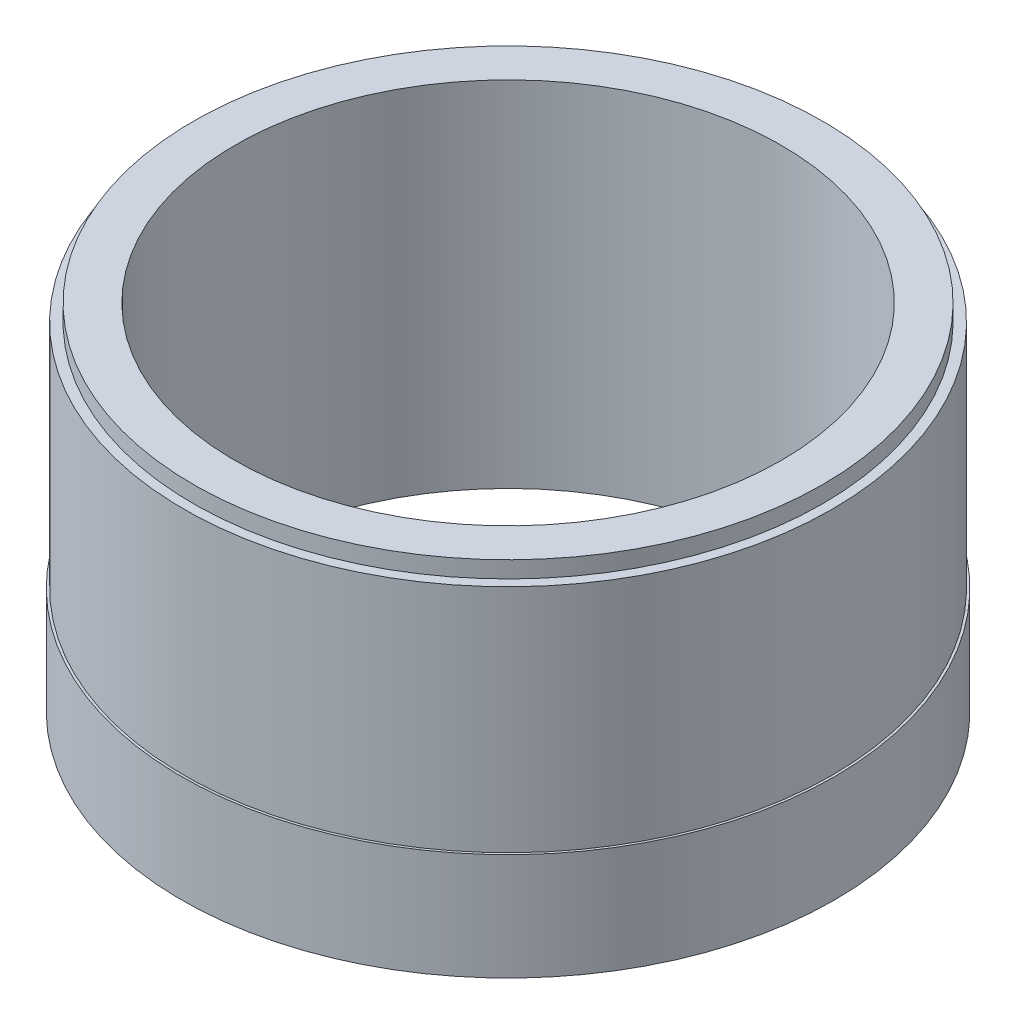
ISO-10303-21;
HEADER;
FILE_DESCRIPTION(('STEP AP214'),'2;1');
FILE_NAME('part.step','',(''),(''),'','','');
FILE_SCHEMA(('AUTOMOTIVE_DESIGN { 1 0 10303 214 1 1 1 1 }'));
ENDSEC;
DATA;
#1=APPLICATION_CONTEXT('core data for automotive mechanical design processes');
#2=APPLICATION_PROTOCOL_DEFINITION('international standard','automotive_design',2000,#1);
#3=PRODUCT_CONTEXT('',#1,'mechanical');
#4=PRODUCT('Part','Part','',(#3));
#5=PRODUCT_RELATED_PRODUCT_CATEGORY('part','',(#4));
#6=PRODUCT_DEFINITION_FORMATION('','',#4);
#7=PRODUCT_DEFINITION_CONTEXT('part definition',#1,'design');
#8=PRODUCT_DEFINITION('design','',#6,#7);
#9=PRODUCT_DEFINITION_SHAPE('','',#8);
#10=(LENGTH_UNIT() NAMED_UNIT(*) SI_UNIT(.MILLI.,.METRE.));
#11=(NAMED_UNIT(*) PLANE_ANGLE_UNIT() SI_UNIT($,.RADIAN.));
#12=(NAMED_UNIT(*) SI_UNIT($,.STERADIAN.) SOLID_ANGLE_UNIT());
#13=UNCERTAINTY_MEASURE_WITH_UNIT(LENGTH_MEASURE(1.E-05),#10,'distance_accuracy_value','');
#14=(GEOMETRIC_REPRESENTATION_CONTEXT(3) GLOBAL_UNCERTAINTY_ASSIGNED_CONTEXT((#13)) GLOBAL_UNIT_ASSIGNED_CONTEXT((#10,
#11,#12)) REPRESENTATION_CONTEXT('',''));
#15=CARTESIAN_POINT('',(0.,0.,0.));
#16=DIRECTION('',(0.,0.,1.));
#17=DIRECTION('',(1.,0.,0.));
#18=AXIS2_PLACEMENT_3D('',#15,#16,#17);
#19=CARTESIAN_POINT('',(137.5,50.,0.));
#20=DIRECTION('',(0.,1.,0.));
#21=DIRECTION('',(-1.,0.,0.));
#22=AXIS2_PLACEMENT_3D('',#19,#20,#21);
#23=PLANE('',#22);
#24=CARTESIAN_POINT('',(0.,50.,0.));
#25=DIRECTION('',(0.,-1.,0.));
#26=DIRECTION('',(1.,0.,0.));
#27=AXIS2_PLACEMENT_3D('',#24,#25,#26);
#28=CIRCLE('',#27,136.5);
#29=CARTESIAN_POINT('',(136.5,50.,0.));
#30=VERTEX_POINT('',#29);
#31=EDGE_CURVE('E65',#30,#30,#28,.T.);
#32=ORIENTED_EDGE('',*,*,#31,.T.);
#33=EDGE_LOOP('',(#32));
#34=FACE_BOUND('',#33,.T.);
#35=CARTESIAN_POINT('',(0.,50.,0.));
#36=DIRECTION('',(0.,-1.,0.));
#37=DIRECTION('',(1.,0.,0.));
#38=AXIS2_PLACEMENT_3D('',#35,#36,#37);
#39=CIRCLE('',#38,137.5);
#40=CARTESIAN_POINT('',(137.5,50.,0.));
#41=VERTEX_POINT('',#40);
#42=EDGE_CURVE('E10',#41,#41,#39,.T.);
#43=ORIENTED_EDGE('',*,*,#42,.F.);
#44=EDGE_LOOP('',(#43));
#45=FACE_BOUND('',#44,.T.);
#46=ADVANCED_FACE('F37',(#34,#45),#23,.T.);
#47=CARTESIAN_POINT('',(0.,154.,0.));
#48=DIRECTION('',(0.,-1.,0.));
#49=DIRECTION('',(1.,0.,0.));
#50=AXIS2_PLACEMENT_3D('',#47,#48,#49);
#51=CYLINDRICAL_SURFACE('',#50,137.5);
#52=ORIENTED_EDGE('',*,*,#42,.T.);
#53=EDGE_LOOP('',(#52));
#54=FACE_BOUND('',#53,.T.);
#55=CARTESIAN_POINT('',(0.,5.,0.));
#56=DIRECTION('',(0.,-1.,0.));
#57=DIRECTION('',(1.,0.,0.));
#58=AXIS2_PLACEMENT_3D('',#55,#56,#57);
#59=CIRCLE('',#58,137.5);
#60=CARTESIAN_POINT('',(137.5,5.00000000000001,0.));
#61=VERTEX_POINT('',#60);
#62=EDGE_CURVE('E43',#61,#61,#59,.T.);
#63=ORIENTED_EDGE('',*,*,#62,.F.);
#64=EDGE_LOOP('',(#63));
#65=FACE_BOUND('',#64,.T.);
#66=ADVANCED_FACE('F83',(#54,#65),#51,.T.);
#67=CARTESIAN_POINT('',(115.,5.,0.));
#68=DIRECTION('',(0.,-1.,0.));
#69=DIRECTION('',(1.,0.,0.));
#70=AXIS2_PLACEMENT_3D('',#67,#68,#69);
#71=PLANE('',#70);
#72=ORIENTED_EDGE('',*,*,#62,.T.);
#73=EDGE_LOOP('',(#72));
#74=FACE_BOUND('',#73,.T.);
#75=CARTESIAN_POINT('',(0.,5.,0.));
#76=DIRECTION('',(0.,-1.,0.));
#77=DIRECTION('',(1.,0.,0.));
#78=AXIS2_PLACEMENT_3D('',#75,#76,#77);
#79=CIRCLE('',#78,115.);
#80=CARTESIAN_POINT('',(115.,5.00000000000001,0.));
#81=VERTEX_POINT('',#80);
#82=EDGE_CURVE('E47',#81,#81,#79,.T.);
#83=ORIENTED_EDGE('',*,*,#82,.F.);
#84=EDGE_LOOP('',(#83));
#85=FACE_BOUND('',#84,.T.);
#86=ADVANCED_FACE('F87',(#74,#85),#71,.T.);
#87=CARTESIAN_POINT('',(0.,154.,0.));
#88=DIRECTION('',(0.,-1.,0.));
#89=DIRECTION('',(1.,0.,0.));
#90=AXIS2_PLACEMENT_3D('',#87,#88,#89);
#91=CYLINDRICAL_SURFACE('',#90,115.);
#92=ORIENTED_EDGE('',*,*,#82,.T.);
#93=EDGE_LOOP('',(#92));
#94=FACE_BOUND('',#93,.T.);
#95=CARTESIAN_POINT('',(0.,154.,0.));
#96=DIRECTION('',(0.,-1.,0.));
#97=DIRECTION('',(1.,0.,0.));
#98=AXIS2_PLACEMENT_3D('',#95,#96,#97);
#99=CIRCLE('',#98,115.);
#100=CARTESIAN_POINT('',(115.,154.,0.));
#101=VERTEX_POINT('',#100);
#102=EDGE_CURVE('E51',#101,#101,#99,.T.);
#103=ORIENTED_EDGE('',*,*,#102,.F.);
#104=EDGE_LOOP('',(#103));
#105=FACE_BOUND('',#104,.T.);
#106=ADVANCED_FACE('F91',(#94,#105),#91,.F.);
#107=CARTESIAN_POINT('',(132.5,154.,0.));
#108=DIRECTION('',(0.,1.,0.));
#109=DIRECTION('',(-1.,0.,0.));
#110=AXIS2_PLACEMENT_3D('',#107,#108,#109);
#111=PLANE('',#110);
#112=ORIENTED_EDGE('',*,*,#102,.T.);
#113=EDGE_LOOP('',(#112));
#114=FACE_BOUND('',#113,.T.);
#115=CARTESIAN_POINT('',(0.,154.,0.));
#116=DIRECTION('',(0.,-1.,0.));
#117=DIRECTION('',(1.,0.,0.));
#118=AXIS2_PLACEMENT_3D('',#115,#116,#117);
#119=CIRCLE('',#118,132.5);
#120=CARTESIAN_POINT('',(132.5,154.,0.));
#121=VERTEX_POINT('',#120);
#122=EDGE_CURVE('E56',#121,#121,#119,.T.);
#123=ORIENTED_EDGE('',*,*,#122,.F.);
#124=EDGE_LOOP('',(#123));
#125=FACE_BOUND('',#124,.T.);
#126=ADVANCED_FACE('F97',(#114,#125),#111,.T.);
#127=CARTESIAN_POINT('',(0.,154.,0.));
#128=DIRECTION('',(0.,-1.,0.));
#129=DIRECTION('',(1.,0.,0.));
#130=AXIS2_PLACEMENT_3D('',#127,#128,#129);
#131=CYLINDRICAL_SURFACE('',#130,132.5);
#132=ORIENTED_EDGE('',*,*,#122,.T.);
#133=EDGE_LOOP('',(#132));
#134=FACE_BOUND('',#133,.T.);
#135=CARTESIAN_POINT('',(0.,147.,0.));
#136=DIRECTION('',(0.,-1.,0.));
#137=DIRECTION('',(1.,0.,0.));
#138=AXIS2_PLACEMENT_3D('',#135,#136,#137);
#139=CIRCLE('',#138,132.5);
#140=CARTESIAN_POINT('',(132.5,147.,0.));
#141=VERTEX_POINT('',#140);
#142=EDGE_CURVE('E59',#141,#141,#139,.T.);
#143=ORIENTED_EDGE('',*,*,#142,.F.);
#144=EDGE_LOOP('',(#143));
#145=FACE_BOUND('',#144,.T.);
#146=ADVANCED_FACE('F79',(#134,#145),#131,.T.);
#147=CARTESIAN_POINT('',(136.5,147.,0.));
#148=DIRECTION('',(0.,1.,0.));
#149=DIRECTION('',(-1.,0.,0.));
#150=AXIS2_PLACEMENT_3D('',#147,#148,#149);
#151=PLANE('',#150);
#152=ORIENTED_EDGE('',*,*,#142,.T.);
#153=EDGE_LOOP('',(#152));
#154=FACE_BOUND('',#153,.T.);
#155=CARTESIAN_POINT('',(0.,147.,0.));
#156=DIRECTION('',(0.,-1.,0.));
#157=DIRECTION('',(1.,0.,0.));
#158=AXIS2_PLACEMENT_3D('',#155,#156,#157);
#159=CIRCLE('',#158,136.5);
#160=CARTESIAN_POINT('',(136.5,147.,0.));
#161=VERTEX_POINT('',#160);
#162=EDGE_CURVE('E62',#161,#161,#159,.T.);
#163=ORIENTED_EDGE('',*,*,#162,.F.);
#164=EDGE_LOOP('',(#163));
#165=FACE_BOUND('',#164,.T.);
#166=ADVANCED_FACE('F73',(#154,#165),#151,.T.);
#167=CARTESIAN_POINT('',(0.,154.,0.));
#168=DIRECTION('',(0.,-1.,0.));
#169=DIRECTION('',(1.,0.,0.));
#170=AXIS2_PLACEMENT_3D('',#167,#168,#169);
#171=CYLINDRICAL_SURFACE('',#170,136.5);
#172=ORIENTED_EDGE('',*,*,#162,.T.);
#173=EDGE_LOOP('',(#172));
#174=FACE_BOUND('',#173,.T.);
#175=ORIENTED_EDGE('',*,*,#31,.F.);
#176=EDGE_LOOP('',(#175));
#177=FACE_BOUND('',#176,.T.);
#178=ADVANCED_FACE('F71',(#174,#177),#171,.T.);
#179=CLOSED_SHELL('',(#46,#66,#86,#106,#126,#146,#166,#178));
#180=MANIFOLD_SOLID_BREP('B2',#179);
#181=ADVANCED_BREP_SHAPE_REPRESENTATION('',(#18,#180),#14);
#182=SHAPE_DEFINITION_REPRESENTATION(#9,#181);
ENDSEC;
END-ISO-10303-21;
